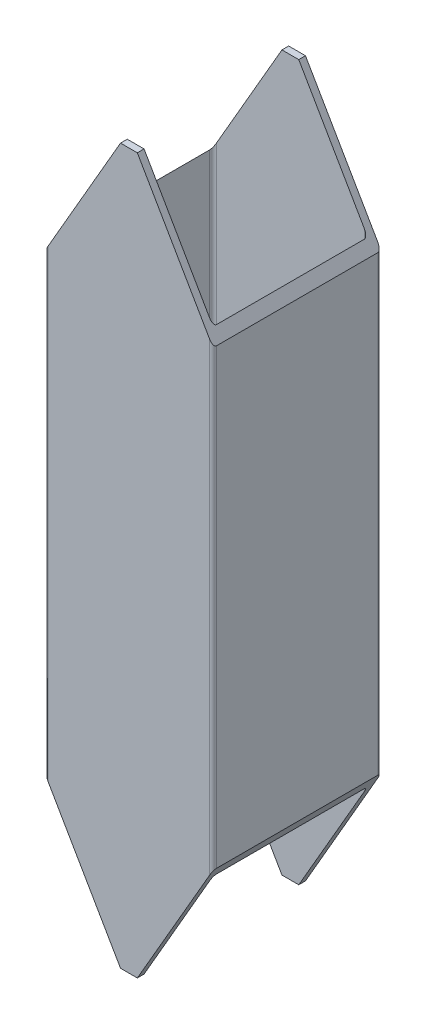
ISO-10303-21;
HEADER;
FILE_DESCRIPTION(('STEP AP214'),'2;1');
FILE_NAME('part.step','',(''),(''),'','','');
FILE_SCHEMA(('AUTOMOTIVE_DESIGN { 1 0 10303 214 1 1 1 1 }'));
ENDSEC;
DATA;
#1=APPLICATION_CONTEXT('core data for automotive mechanical design processes');
#2=APPLICATION_PROTOCOL_DEFINITION('international standard','automotive_design',2000,#1);
#3=PRODUCT_CONTEXT('',#1,'mechanical');
#4=PRODUCT('Part','Part','',(#3));
#5=PRODUCT_RELATED_PRODUCT_CATEGORY('part','',(#4));
#6=PRODUCT_DEFINITION_FORMATION('','',#4);
#7=PRODUCT_DEFINITION_CONTEXT('part definition',#1,'design');
#8=PRODUCT_DEFINITION('design','',#6,#7);
#9=PRODUCT_DEFINITION_SHAPE('','',#8);
#10=(LENGTH_UNIT() NAMED_UNIT(*) SI_UNIT(.MILLI.,.METRE.));
#11=(NAMED_UNIT(*) PLANE_ANGLE_UNIT() SI_UNIT($,.RADIAN.));
#12=(NAMED_UNIT(*) SI_UNIT($,.STERADIAN.) SOLID_ANGLE_UNIT());
#13=UNCERTAINTY_MEASURE_WITH_UNIT(LENGTH_MEASURE(1.E-05),#10,'distance_accuracy_value','');
#14=(GEOMETRIC_REPRESENTATION_CONTEXT(3) GLOBAL_UNCERTAINTY_ASSIGNED_CONTEXT((#13)) GLOBAL_UNIT_ASSIGNED_CONTEXT((#10,
#11,#12)) REPRESENTATION_CONTEXT('',''));
#15=CARTESIAN_POINT('',(0.,0.,0.));
#16=DIRECTION('',(0.,0.,1.));
#17=DIRECTION('',(1.,0.,0.));
#18=AXIS2_PLACEMENT_3D('',#15,#16,#17);
#19=CARTESIAN_POINT('',(2.,425.,-2.));
#20=DIRECTION('',(0.,1.,0.));
#21=DIRECTION('',(0.,0.,1.));
#22=AXIS2_PLACEMENT_3D('',#19,#20,#21);
#23=PLANE('',#22);
#24=DIRECTION('',(0.,0.,1.));
#25=VECTOR('',#24,1.);
#26=CARTESIAN_POINT('',(55.,425.,-100.));
#27=LINE('',#26,#25);
#28=CARTESIAN_POINT('',(55.,425.,-100.));
#29=VERTEX_POINT('',#28);
#30=CARTESIAN_POINT('',(55.,425.,-96.));
#31=VERTEX_POINT('',#30);
#32=EDGE_CURVE('E49',#29,#31,#27,.T.);
#33=ORIENTED_EDGE('',*,*,#32,.F.);
#34=DIRECTION('',(-1.,0.,0.));
#35=VECTOR('',#34,1.);
#36=CARTESIAN_POINT('',(2.00000000000001,425.,-100.));
#37=LINE('',#36,#35);
#38=CARTESIAN_POINT('',(45.,425.,-100.));
#39=VERTEX_POINT('',#38);
#40=EDGE_CURVE('E206',#29,#39,#37,.T.);
#41=ORIENTED_EDGE('',*,*,#40,.T.);
#42=DIRECTION('',(0.,0.,1.));
#43=VECTOR('',#42,1.);
#44=CARTESIAN_POINT('',(45.,425.,-100.));
#45=LINE('',#44,#43);
#46=CARTESIAN_POINT('',(45.,425.,-96.));
#47=VERTEX_POINT('',#46);
#48=EDGE_CURVE('E351',#39,#47,#45,.T.);
#49=ORIENTED_EDGE('',*,*,#48,.T.);
#50=DIRECTION('',(-1.,0.,0.));
#51=VECTOR('',#50,1.);
#52=CARTESIAN_POINT('',(6.00000000000001,425.,-96.));
#53=LINE('',#52,#51);
#54=EDGE_CURVE('E208',#31,#47,#53,.T.);
#55=ORIENTED_EDGE('',*,*,#54,.F.);
#56=EDGE_LOOP('',(#33,#41,#49,#55));
#57=FACE_BOUND('',#56,.T.);
#58=ADVANCED_FACE('F35',(#57),#23,.T.);
#59=CARTESIAN_POINT('',(2.,0.,-2.));
#60=DIRECTION('',(0.,1.,0.));
#61=DIRECTION('',(0.,0.,1.));
#62=AXIS2_PLACEMENT_3D('',#59,#60,#61);
#63=PLANE('',#62);
#64=DIRECTION('',(1.,0.,0.));
#65=VECTOR('',#64,1.);
#66=CARTESIAN_POINT('',(2.00000000000001,0.,0.));
#67=LINE('',#66,#65);
#68=CARTESIAN_POINT('',(45.,0.,0.));
#69=VERTEX_POINT('',#68);
#70=CARTESIAN_POINT('',(55.,0.,0.));
#71=VERTEX_POINT('',#70);
#72=EDGE_CURVE('E227',#69,#71,#67,.T.);
#73=ORIENTED_EDGE('',*,*,#72,.F.);
#74=DIRECTION('',(0.,0.,1.));
#75=VECTOR('',#74,1.);
#76=CARTESIAN_POINT('',(45.,0.,-100.));
#77=LINE('',#76,#75);
#78=CARTESIAN_POINT('',(45.,0.,-4.));
#79=VERTEX_POINT('',#78);
#80=EDGE_CURVE('E406',#79,#69,#77,.T.);
#81=ORIENTED_EDGE('',*,*,#80,.F.);
#82=DIRECTION('',(1.,0.,0.));
#83=VECTOR('',#82,1.);
#84=CARTESIAN_POINT('',(6.00000000000001,0.,-4.));
#85=LINE('',#84,#83);
#86=CARTESIAN_POINT('',(55.,0.,-4.));
#87=VERTEX_POINT('',#86);
#88=EDGE_CURVE('E367',#79,#87,#85,.T.);
#89=ORIENTED_EDGE('',*,*,#88,.T.);
#90=DIRECTION('',(0.,0.,1.));
#91=VECTOR('',#90,1.);
#92=CARTESIAN_POINT('',(55.,0.,-100.));
#93=LINE('',#92,#91);
#94=EDGE_CURVE('E327',#87,#71,#93,.T.);
#95=ORIENTED_EDGE('',*,*,#94,.T.);
#96=EDGE_LOOP('',(#73,#81,#89,#95));
#97=FACE_BOUND('',#96,.T.);
#98=ADVANCED_FACE('F418',(#97),#63,.F.);
#99=CARTESIAN_POINT('',(55.,425.,-4.));
#100=VERTEX_POINT('',#99);
#101=CARTESIAN_POINT('',(55.,425.,0.));
#102=VERTEX_POINT('',#101);
#103=EDGE_CURVE('E210',#100,#102,#27,.T.);
#104=ORIENTED_EDGE('',*,*,#103,.F.);
#105=DIRECTION('',(1.,0.,0.));
#106=VECTOR('',#105,1.);
#107=CARTESIAN_POINT('',(6.00000000000001,425.,-4.));
#108=LINE('',#107,#106);
#109=CARTESIAN_POINT('',(45.,425.,-4.));
#110=VERTEX_POINT('',#109);
#111=EDGE_CURVE('E276',#110,#100,#108,.T.);
#112=ORIENTED_EDGE('',*,*,#111,.F.);
#113=CARTESIAN_POINT('',(45.,425.,0.));
#114=VERTEX_POINT('',#113);
#115=EDGE_CURVE('E354',#110,#114,#45,.T.);
#116=ORIENTED_EDGE('',*,*,#115,.T.);
#117=DIRECTION('',(1.,0.,0.));
#118=VECTOR('',#117,1.);
#119=CARTESIAN_POINT('',(2.00000000000001,425.,0.));
#120=LINE('',#119,#118);
#121=EDGE_CURVE('E217',#114,#102,#120,.T.);
#122=ORIENTED_EDGE('',*,*,#121,.T.);
#123=EDGE_LOOP('',(#104,#112,#116,#122));
#124=FACE_BOUND('',#123,.T.);
#125=ADVANCED_FACE('F436',(#124),#23,.T.);
#126=DIRECTION('',(-1.,0.,0.));
#127=VECTOR('',#126,1.);
#128=CARTESIAN_POINT('',(6.00000000000001,0.,-96.));
#129=LINE('',#128,#127);
#130=CARTESIAN_POINT('',(55.,0.,-96.));
#131=VERTEX_POINT('',#130);
#132=CARTESIAN_POINT('',(45.,0.,-96.));
#133=VERTEX_POINT('',#132);
#134=EDGE_CURVE('E279',#131,#133,#129,.T.);
#135=ORIENTED_EDGE('',*,*,#134,.T.);
#136=CARTESIAN_POINT('',(45.,0.,-100.));
#137=VERTEX_POINT('',#136);
#138=EDGE_CURVE('E57',#137,#133,#77,.T.);
#139=ORIENTED_EDGE('',*,*,#138,.F.);
#140=DIRECTION('',(-1.,0.,0.));
#141=VECTOR('',#140,1.);
#142=CARTESIAN_POINT('',(2.00000000000001,0.,-100.));
#143=LINE('',#142,#141);
#144=CARTESIAN_POINT('',(55.,0.,-100.));
#145=VERTEX_POINT('',#144);
#146=EDGE_CURVE('E223',#145,#137,#143,.T.);
#147=ORIENTED_EDGE('',*,*,#146,.F.);
#148=EDGE_CURVE('E323',#145,#131,#93,.T.);
#149=ORIENTED_EDGE('',*,*,#148,.T.);
#150=EDGE_LOOP('',(#135,#139,#147,#149));
#151=FACE_BOUND('',#150,.T.);
#152=ADVANCED_FACE('F375',(#151),#63,.F.);
#153=CARTESIAN_POINT('',(2.,425.,-2.));
#154=DIRECTION('',(0.,-1.,0.));
#155=DIRECTION('',(0.,0.,-1.));
#156=AXIS2_PLACEMENT_3D('',#153,#154,#155);
#157=CYLINDRICAL_SURFACE('',#156,2.);
#158=DIRECTION('',(0.,-1.,0.));
#159=VECTOR('',#158,1.);
#160=CARTESIAN_POINT('',(0.,425.,-2.00000000000001));
#161=LINE('',#160,#159);
#162=CARTESIAN_POINT('',(0.,347.0577136594,-2.00000000000002));
#163=VERTEX_POINT('',#162);
#164=CARTESIAN_POINT('',(0.,77.9422863405987,-2.00000000000002));
#165=VERTEX_POINT('',#164);
#166=EDGE_CURVE('E216',#163,#165,#161,.T.);
#167=ORIENTED_EDGE('',*,*,#166,.T.);
#168=CARTESIAN_POINT('',(2.,74.478184725461,-2.));
#169=DIRECTION('',(0.866025403784436,0.500000000000004,0.));
#170=DIRECTION('',(0.500000000000004,-0.866025403784437,0.));
#171=AXIS2_PLACEMENT_3D('',#168,#169,#170);
#172=ELLIPSE('',#171,3.99999999999997,2.);
#173=CARTESIAN_POINT('',(2.00000000000005,74.4781847254609,0.));
#174=VERTEX_POINT('',#173);
#175=EDGE_CURVE('E313',#165,#174,#172,.T.);
#176=ORIENTED_EDGE('',*,*,#175,.T.);
#177=DIRECTION('',(0.,-1.,0.));
#178=VECTOR('',#177,1.);
#179=CARTESIAN_POINT('',(2.00000000000001,425.,0.));
#180=LINE('',#179,#178);
#181=CARTESIAN_POINT('',(2.00000000000002,350.521815274538,0.));
#182=VERTEX_POINT('',#181);
#183=EDGE_CURVE('E245',#182,#174,#180,.T.);
#184=ORIENTED_EDGE('',*,*,#183,.F.);
#185=CARTESIAN_POINT('',(2.,350.521815274538,-2.));
#186=DIRECTION('',(0.86602540378444,-0.499999999999998,0.));
#187=DIRECTION('',(-0.499999999999998,-0.86602540378444,0.));
#188=AXIS2_PLACEMENT_3D('',#185,#186,#187);
#189=ELLIPSE('',#188,4.00000000000002,2.);
#190=EDGE_CURVE('E364',#182,#163,#189,.T.);
#191=ORIENTED_EDGE('',*,*,#190,.T.);
#192=EDGE_LOOP('',(#167,#176,#184,#191));
#193=FACE_BOUND('',#192,.T.);
#194=ADVANCED_FACE('F37',(#193),#157,.T.);
#195=CARTESIAN_POINT('',(2.00000000000001,425.,0.));
#196=DIRECTION('',(0.,0.,-1.));
#197=DIRECTION('',(-1.,0.,0.));
#198=AXIS2_PLACEMENT_3D('',#195,#196,#197);
#199=PLANE('',#198);
#200=DIRECTION('',(0.,-1.,0.));
#201=VECTOR('',#200,1.);
#202=CARTESIAN_POINT('',(98.,425.,0.));
#203=LINE('',#202,#201);
#204=CARTESIAN_POINT('',(98.,350.521815274538,0.));
#205=VERTEX_POINT('',#204);
#206=CARTESIAN_POINT('',(98.,74.478184725461,0.));
#207=VERTEX_POINT('',#206);
#208=EDGE_CURVE('E243',#205,#207,#203,.T.);
#209=ORIENTED_EDGE('',*,*,#208,.F.);
#210=DIRECTION('',(0.499999999999998,-0.86602540378444,0.));
#211=VECTOR('',#210,1.);
#212=CARTESIAN_POINT('',(55.,425.,0.));
#213=LINE('',#212,#211);
#214=EDGE_CURVE('E201',#102,#205,#213,.T.);
#215=ORIENTED_EDGE('',*,*,#214,.F.);
#216=ORIENTED_EDGE('',*,*,#121,.F.);
#217=DIRECTION('',(0.499999999999998,0.86602540378444,0.));
#218=VECTOR('',#217,1.);
#219=CARTESIAN_POINT('',(45.,425.,0.));
#220=LINE('',#219,#218);
#221=EDGE_CURVE('E347',#182,#114,#220,.T.);
#222=ORIENTED_EDGE('',*,*,#221,.F.);
#223=ORIENTED_EDGE('',*,*,#183,.T.);
#224=DIRECTION('',(-0.500000000000004,0.866025403784436,0.));
#225=VECTOR('',#224,1.);
#226=CARTESIAN_POINT('',(45.,0.,0.));
#227=LINE('',#226,#225);
#228=EDGE_CURVE('E402',#69,#174,#227,.T.);
#229=ORIENTED_EDGE('',*,*,#228,.F.);
#230=ORIENTED_EDGE('',*,*,#72,.T.);
#231=DIRECTION('',(-0.500000000000003,-0.866025403784437,0.));
#232=VECTOR('',#231,1.);
#233=CARTESIAN_POINT('',(55.,0.,0.));
#234=LINE('',#233,#232);
#235=EDGE_CURVE('E316',#207,#71,#234,.T.);
#236=ORIENTED_EDGE('',*,*,#235,.F.);
#237=EDGE_LOOP('',(#209,#215,#216,#222,#223,#229,#230,#236));
#238=FACE_BOUND('',#237,.T.);
#239=ADVANCED_FACE('F414',(#238),#199,.F.);
#240=CARTESIAN_POINT('',(98.,425.,-2.));
#241=DIRECTION('',(0.,-1.,0.));
#242=DIRECTION('',(0.,0.,-1.));
#243=AXIS2_PLACEMENT_3D('',#240,#241,#242);
#244=CYLINDRICAL_SURFACE('',#243,2.);
#245=DIRECTION('',(0.,-1.,0.));
#246=VECTOR('',#245,1.);
#247=CARTESIAN_POINT('',(100.,425.,-2.00000000000001));
#248=LINE('',#247,#246);
#249=CARTESIAN_POINT('',(100.,347.0577136594,-2.00000000000002));
#250=VERTEX_POINT('',#249);
#251=CARTESIAN_POINT('',(100.,77.9422863405988,-2.00000000000002));
#252=VERTEX_POINT('',#251);
#253=EDGE_CURVE('E241',#250,#252,#248,.T.);
#254=ORIENTED_EDGE('',*,*,#253,.F.);
#255=CARTESIAN_POINT('',(98.,350.521815274538,-2.));
#256=DIRECTION('',(-0.86602540378444,-0.499999999999998,0.));
#257=DIRECTION('',(0.499999999999998,-0.86602540378444,0.));
#258=AXIS2_PLACEMENT_3D('',#255,#256,#257);
#259=ELLIPSE('',#258,4.00000000000002,2.);
#260=EDGE_CURVE('E399',#250,#205,#259,.T.);
#261=ORIENTED_EDGE('',*,*,#260,.T.);
#262=ORIENTED_EDGE('',*,*,#208,.T.);
#263=CARTESIAN_POINT('',(98.,74.478184725461,-2.));
#264=DIRECTION('',(-0.866025403784437,0.500000000000003,0.));
#265=DIRECTION('',(-0.500000000000003,-0.866025403784437,0.));
#266=AXIS2_PLACEMENT_3D('',#263,#264,#265);
#267=ELLIPSE('',#266,3.99999999999997,2.);
#268=EDGE_CURVE('E344',#207,#252,#267,.T.);
#269=ORIENTED_EDGE('',*,*,#268,.T.);
#270=EDGE_LOOP('',(#254,#261,#262,#269));
#271=FACE_BOUND('',#270,.T.);
#272=ADVANCED_FACE('F446',(#271),#244,.T.);
#273=CARTESIAN_POINT('',(100.,425.,-2.00000000000001));
#274=DIRECTION('',(-1.,0.,0.));
#275=DIRECTION('',(0.,0.,1.));
#276=AXIS2_PLACEMENT_3D('',#273,#274,#275);
#277=PLANE('',#276);
#278=DIRECTION('',(0.,-1.,0.));
#279=VECTOR('',#278,1.);
#280=CARTESIAN_POINT('',(100.,425.,-98.));
#281=LINE('',#280,#279);
#282=CARTESIAN_POINT('',(100.,347.0577136594,-98.));
#283=VERTEX_POINT('',#282);
#284=CARTESIAN_POINT('',(100.,77.9422863405988,-98.));
#285=VERTEX_POINT('',#284);
#286=EDGE_CURVE('E239',#283,#285,#281,.T.);
#287=ORIENTED_EDGE('',*,*,#286,.F.);
#288=DIRECTION('',(0.,0.,1.));
#289=VECTOR('',#288,1.);
#290=CARTESIAN_POINT('',(100.,347.0577136594,-100.));
#291=LINE('',#290,#289);
#292=EDGE_CURVE('E200',#283,#250,#291,.T.);
#293=ORIENTED_EDGE('',*,*,#292,.T.);
#294=ORIENTED_EDGE('',*,*,#253,.T.);
#295=DIRECTION('',(0.,0.,1.));
#296=VECTOR('',#295,1.);
#297=CARTESIAN_POINT('',(100.,77.9422863405988,-100.));
#298=LINE('',#297,#296);
#299=EDGE_CURVE('E320',#285,#252,#298,.T.);
#300=ORIENTED_EDGE('',*,*,#299,.F.);
#301=EDGE_LOOP('',(#287,#293,#294,#300));
#302=FACE_BOUND('',#301,.T.);
#303=ADVANCED_FACE('F450',(#302),#277,.F.);
#304=CARTESIAN_POINT('',(98.,425.,-98.));
#305=DIRECTION('',(0.,-1.,0.));
#306=DIRECTION('',(0.,0.,-1.));
#307=AXIS2_PLACEMENT_3D('',#304,#305,#306);
#308=CYLINDRICAL_SURFACE('',#307,2.);
#309=DIRECTION('',(0.,-1.,0.));
#310=VECTOR('',#309,1.);
#311=CARTESIAN_POINT('',(98.,425.,-100.));
#312=LINE('',#311,#310);
#313=CARTESIAN_POINT('',(98.,350.521815274538,-100.));
#314=VERTEX_POINT('',#313);
#315=CARTESIAN_POINT('',(98.,74.478184725461,-100.));
#316=VERTEX_POINT('',#315);
#317=EDGE_CURVE('E237',#314,#316,#312,.T.);
#318=ORIENTED_EDGE('',*,*,#317,.F.);
#319=CARTESIAN_POINT('',(98.,350.521815274538,-98.));
#320=DIRECTION('',(-0.86602540378444,-0.499999999999998,0.));
#321=DIRECTION('',(0.499999999999998,-0.86602540378444,0.));
#322=AXIS2_PLACEMENT_3D('',#319,#320,#321);
#323=ELLIPSE('',#322,4.00000000000002,2.);
#324=EDGE_CURVE('E196',#314,#283,#323,.T.);
#325=ORIENTED_EDGE('',*,*,#324,.T.);
#326=ORIENTED_EDGE('',*,*,#286,.T.);
#327=CARTESIAN_POINT('',(98.,74.478184725461,-98.));
#328=DIRECTION('',(-0.866025403784437,0.500000000000003,0.));
#329=DIRECTION('',(-0.500000000000003,-0.866025403784437,0.));
#330=AXIS2_PLACEMENT_3D('',#327,#328,#329);
#331=ELLIPSE('',#330,3.99999999999998,2.);
#332=EDGE_CURVE('E341',#285,#316,#331,.T.);
#333=ORIENTED_EDGE('',*,*,#332,.T.);
#334=EDGE_LOOP('',(#318,#325,#326,#333));
#335=FACE_BOUND('',#334,.T.);
#336=ADVANCED_FACE('F453',(#335),#308,.T.);
#337=CARTESIAN_POINT('',(2.00000000000001,425.,-100.));
#338=DIRECTION('',(0.,0.,1.));
#339=DIRECTION('',(1.,0.,0.));
#340=AXIS2_PLACEMENT_3D('',#337,#338,#339);
#341=PLANE('',#340);
#342=ORIENTED_EDGE('',*,*,#40,.F.);
#343=DIRECTION('',(0.499999999999998,-0.86602540378444,0.));
#344=VECTOR('',#343,1.);
#345=CARTESIAN_POINT('',(55.,425.,-100.));
#346=LINE('',#345,#344);
#347=EDGE_CURVE('E193',#29,#314,#346,.T.);
#348=ORIENTED_EDGE('',*,*,#347,.T.);
#349=ORIENTED_EDGE('',*,*,#317,.T.);
#350=DIRECTION('',(-0.500000000000003,-0.866025403784437,0.));
#351=VECTOR('',#350,1.);
#352=CARTESIAN_POINT('',(55.,0.,-100.));
#353=LINE('',#352,#351);
#354=EDGE_CURVE('E317',#316,#145,#353,.T.);
#355=ORIENTED_EDGE('',*,*,#354,.T.);
#356=ORIENTED_EDGE('',*,*,#146,.T.);
#357=DIRECTION('',(-0.500000000000004,0.866025403784436,0.));
#358=VECTOR('',#357,1.);
#359=CARTESIAN_POINT('',(45.,0.,-100.));
#360=LINE('',#359,#358);
#361=CARTESIAN_POINT('',(1.99999999999998,74.478184725461,-100.));
#362=VERTEX_POINT('',#361);
#363=EDGE_CURVE('E403',#137,#362,#360,.T.);
#364=ORIENTED_EDGE('',*,*,#363,.T.);
#365=DIRECTION('',(0.,-1.,0.));
#366=VECTOR('',#365,1.);
#367=CARTESIAN_POINT('',(2.00000000000001,425.,-100.));
#368=LINE('',#367,#366);
#369=CARTESIAN_POINT('',(2.,350.521815274538,-100.));
#370=VERTEX_POINT('',#369);
#371=EDGE_CURVE('E234',#370,#362,#368,.T.);
#372=ORIENTED_EDGE('',*,*,#371,.F.);
#373=DIRECTION('',(0.499999999999998,0.86602540378444,0.));
#374=VECTOR('',#373,1.);
#375=CARTESIAN_POINT('',(45.,425.,-100.));
#376=LINE('',#375,#374);
#377=EDGE_CURVE('E215',#370,#39,#376,.T.);
#378=ORIENTED_EDGE('',*,*,#377,.T.);
#379=EDGE_LOOP('',(#342,#348,#349,#355,#356,#364,#372,#378));
#380=FACE_BOUND('',#379,.T.);
#381=ADVANCED_FACE('F213',(#380),#341,.F.);
#382=CARTESIAN_POINT('',(2.,425.,-98.));
#383=DIRECTION('',(0.,-1.,0.));
#384=DIRECTION('',(0.,0.,-1.));
#385=AXIS2_PLACEMENT_3D('',#382,#383,#384);
#386=CYLINDRICAL_SURFACE('',#385,2.);
#387=ORIENTED_EDGE('',*,*,#371,.T.);
#388=CARTESIAN_POINT('',(2.,74.478184725461,-98.));
#389=DIRECTION('',(0.866025403784436,0.500000000000004,0.));
#390=DIRECTION('',(0.500000000000004,-0.866025403784437,0.));
#391=AXIS2_PLACEMENT_3D('',#388,#389,#390);
#392=ELLIPSE('',#391,3.99999999999997,2.);
#393=CARTESIAN_POINT('',(0.,77.9422863405987,-98.));
#394=VERTEX_POINT('',#393);
#395=EDGE_CURVE('E307',#362,#394,#392,.T.);
#396=ORIENTED_EDGE('',*,*,#395,.T.);
#397=DIRECTION('',(0.,-1.,0.));
#398=VECTOR('',#397,1.);
#399=CARTESIAN_POINT('',(0.,425.,-98.));
#400=LINE('',#399,#398);
#401=CARTESIAN_POINT('',(0.,347.0577136594,-98.));
#402=VERTEX_POINT('',#401);
#403=EDGE_CURVE('E220',#402,#394,#400,.T.);
#404=ORIENTED_EDGE('',*,*,#403,.F.);
#405=CARTESIAN_POINT('',(2.,350.521815274538,-98.));
#406=DIRECTION('',(0.86602540378444,-0.499999999999998,0.));
#407=DIRECTION('',(-0.499999999999998,-0.86602540378444,0.));
#408=AXIS2_PLACEMENT_3D('',#405,#406,#407);
#409=ELLIPSE('',#408,4.00000000000002,2.);
#410=EDGE_CURVE('E361',#402,#370,#409,.T.);
#411=ORIENTED_EDGE('',*,*,#410,.T.);
#412=EDGE_LOOP('',(#387,#396,#404,#411));
#413=FACE_BOUND('',#412,.T.);
#414=ADVANCED_FACE('F455',(#413),#386,.T.);
#415=CARTESIAN_POINT('',(0.,425.,-2.00000000000001));
#416=DIRECTION('',(1.,0.,0.));
#417=DIRECTION('',(0.,0.,-1.));
#418=AXIS2_PLACEMENT_3D('',#415,#416,#417);
#419=PLANE('',#418);
#420=ORIENTED_EDGE('',*,*,#403,.T.);
#421=DIRECTION('',(0.,0.,1.));
#422=VECTOR('',#421,1.);
#423=CARTESIAN_POINT('',(0.,77.9422863405987,-100.));
#424=LINE('',#423,#422);
#425=EDGE_CURVE('E268',#394,#165,#424,.T.);
#426=ORIENTED_EDGE('',*,*,#425,.T.);
#427=ORIENTED_EDGE('',*,*,#166,.F.);
#428=DIRECTION('',(0.,0.,1.));
#429=VECTOR('',#428,1.);
#430=CARTESIAN_POINT('',(0.,347.0577136594,-100.));
#431=LINE('',#430,#429);
#432=EDGE_CURVE('E349',#402,#163,#431,.T.);
#433=ORIENTED_EDGE('',*,*,#432,.F.);
#434=EDGE_LOOP('',(#420,#426,#427,#433));
#435=FACE_BOUND('',#434,.T.);
#436=ADVANCED_FACE('F460',(#435),#419,.F.);
#437=CARTESIAN_POINT('',(6.,425.,-94.));
#438=DIRECTION('',(0.,-1.,0.));
#439=DIRECTION('',(0.,0.,-1.));
#440=AXIS2_PLACEMENT_3D('',#437,#438,#439);
#441=CYLINDRICAL_SURFACE('',#440,2.);
#442=CARTESIAN_POINT('',(6.,67.5499814951855,-94.));
#443=DIRECTION('',(0.866025403784436,0.500000000000004,0.));
#444=DIRECTION('',(0.500000000000004,-0.866025403784437,0.));
#445=AXIS2_PLACEMENT_3D('',#442,#443,#444);
#446=ELLIPSE('',#445,3.99999999999997,2.);
#447=CARTESIAN_POINT('',(6.00000000000001,67.5499814951854,-96.));
#448=VERTEX_POINT('',#447);
#449=CARTESIAN_POINT('',(4.,71.0140831103233,-94.));
#450=VERTEX_POINT('',#449);
#451=EDGE_CURVE('E254',#448,#450,#446,.T.);
#452=ORIENTED_EDGE('',*,*,#451,.F.);
#453=DIRECTION('',(0.,-1.,0.));
#454=VECTOR('',#453,1.);
#455=CARTESIAN_POINT('',(6.00000000000001,425.,-96.));
#456=LINE('',#455,#454);
#457=CARTESIAN_POINT('',(6.00000000000001,357.450018504813,-96.));
#458=VERTEX_POINT('',#457);
#459=EDGE_CURVE('E265',#458,#448,#456,.T.);
#460=ORIENTED_EDGE('',*,*,#459,.F.);
#461=CARTESIAN_POINT('',(6.,357.450018504813,-94.));
#462=DIRECTION('',(0.86602540378444,-0.499999999999998,0.));
#463=DIRECTION('',(-0.499999999999998,-0.86602540378444,0.));
#464=AXIS2_PLACEMENT_3D('',#461,#462,#463);
#465=ELLIPSE('',#464,4.00000000000002,2.);
#466=CARTESIAN_POINT('',(4.,353.985916889676,-94.));
#467=VERTEX_POINT('',#466);
#468=EDGE_CURVE('E353',#467,#458,#465,.T.);
#469=ORIENTED_EDGE('',*,*,#468,.F.);
#470=DIRECTION('',(0.,-1.,0.));
#471=VECTOR('',#470,1.);
#472=CARTESIAN_POINT('',(4.,425.,-94.));
#473=LINE('',#472,#471);
#474=EDGE_CURVE('E229',#467,#450,#473,.T.);
#475=ORIENTED_EDGE('',*,*,#474,.T.);
#476=EDGE_LOOP('',(#452,#460,#469,#475));
#477=FACE_BOUND('',#476,.T.);
#478=ADVANCED_FACE('F263',(#477),#441,.F.);
#479=CARTESIAN_POINT('',(4.,425.,-6.00000000000001));
#480=DIRECTION('',(1.,0.,0.));
#481=DIRECTION('',(0.,0.,-1.));
#482=AXIS2_PLACEMENT_3D('',#479,#480,#481);
#483=PLANE('',#482);
#484=DIRECTION('',(0.,0.,1.));
#485=VECTOR('',#484,1.);
#486=CARTESIAN_POINT('',(4.,71.0140831103233,-6.00000000000001));
#487=LINE('',#486,#485);
#488=CARTESIAN_POINT('',(4.,71.0140831103233,-6.00000000000001));
#489=VERTEX_POINT('',#488);
#490=EDGE_CURVE('E267',#450,#489,#487,.T.);
#491=ORIENTED_EDGE('',*,*,#490,.F.);
#492=ORIENTED_EDGE('',*,*,#474,.F.);
#493=DIRECTION('',(0.,0.,-1.));
#494=VECTOR('',#493,1.);
#495=CARTESIAN_POINT('',(4.,353.985916889676,-6.00000000000001));
#496=LINE('',#495,#494);
#497=CARTESIAN_POINT('',(4.,353.985916889676,-6.00000000000001));
#498=VERTEX_POINT('',#497);
#499=EDGE_CURVE('E296',#498,#467,#496,.T.);
#500=ORIENTED_EDGE('',*,*,#499,.F.);
#501=DIRECTION('',(0.,-1.,0.));
#502=VECTOR('',#501,1.);
#503=CARTESIAN_POINT('',(4.,425.,-6.00000000000001));
#504=LINE('',#503,#502);
#505=EDGE_CURVE('E290',#498,#489,#504,.T.);
#506=ORIENTED_EDGE('',*,*,#505,.T.);
#507=EDGE_LOOP('',(#491,#492,#500,#506));
#508=FACE_BOUND('',#507,.T.);
#509=ADVANCED_FACE('F295',(#508),#483,.T.);
#510=CARTESIAN_POINT('',(6.,425.,-6.));
#511=DIRECTION('',(0.,-1.,0.));
#512=DIRECTION('',(0.,0.,-1.));
#513=AXIS2_PLACEMENT_3D('',#510,#511,#512);
#514=CYLINDRICAL_SURFACE('',#513,2.);
#515=CARTESIAN_POINT('',(6.,67.5499814951855,-6.));
#516=DIRECTION('',(0.866025403784436,0.500000000000004,0.));
#517=DIRECTION('',(0.500000000000004,-0.866025403784437,0.));
#518=AXIS2_PLACEMENT_3D('',#515,#516,#517);
#519=ELLIPSE('',#518,3.99999999999997,2.);
#520=CARTESIAN_POINT('',(6.00000000000001,67.5499814951855,-4.));
#521=VERTEX_POINT('',#520);
#522=EDGE_CURVE('E303',#489,#521,#519,.T.);
#523=ORIENTED_EDGE('',*,*,#522,.F.);
#524=ORIENTED_EDGE('',*,*,#505,.F.);
#525=CARTESIAN_POINT('',(6.,357.450018504813,-6.));
#526=DIRECTION('',(0.86602540378444,-0.499999999999998,0.));
#527=DIRECTION('',(-0.499999999999998,-0.86602540378444,0.));
#528=AXIS2_PLACEMENT_3D('',#525,#526,#527);
#529=ELLIPSE('',#528,4.00000000000002,2.);
#530=CARTESIAN_POINT('',(6.00000000000001,357.450018504813,-4.));
#531=VERTEX_POINT('',#530);
#532=EDGE_CURVE('E301',#531,#498,#529,.T.);
#533=ORIENTED_EDGE('',*,*,#532,.F.);
#534=DIRECTION('',(0.,-1.,0.));
#535=VECTOR('',#534,1.);
#536=CARTESIAN_POINT('',(6.00000000000001,425.,-4.));
#537=LINE('',#536,#535);
#538=EDGE_CURVE('E287',#531,#521,#537,.T.);
#539=ORIENTED_EDGE('',*,*,#538,.T.);
#540=EDGE_LOOP('',(#523,#524,#533,#539));
#541=FACE_BOUND('',#540,.T.);
#542=ADVANCED_FACE('F300',(#541),#514,.F.);
#543=CARTESIAN_POINT('',(6.00000000000001,425.,-4.));
#544=DIRECTION('',(0.,0.,-1.));
#545=DIRECTION('',(-1.,0.,0.));
#546=AXIS2_PLACEMENT_3D('',#543,#544,#545);
#547=PLANE('',#546);
#548=DIRECTION('',(-0.499999999999998,0.86602540378444,0.));
#549=VECTOR('',#548,1.);
#550=CARTESIAN_POINT('',(42.7500000000001,446.217622392719,-4.));
#551=LINE('',#550,#549);
#552=CARTESIAN_POINT('',(94.,357.450018504813,-4.));
#553=VERTEX_POINT('',#552);
#554=EDGE_CURVE('E396',#553,#100,#551,.T.);
#555=ORIENTED_EDGE('',*,*,#554,.F.);
#556=DIRECTION('',(0.,-1.,0.));
#557=VECTOR('',#556,1.);
#558=CARTESIAN_POINT('',(94.,425.,-4.));
#559=LINE('',#558,#557);
#560=CARTESIAN_POINT('',(94.,67.5499814951856,-4.));
#561=VERTEX_POINT('',#560);
#562=EDGE_CURVE('E285',#553,#561,#559,.T.);
#563=ORIENTED_EDGE('',*,*,#562,.T.);
#564=DIRECTION('',(0.500000000000003,0.866025403784437,0.));
#565=VECTOR('',#564,1.);
#566=CARTESIAN_POINT('',(226.780398304194,297.53237760728,-4.));
#567=LINE('',#566,#565);
#568=EDGE_CURVE('E338',#87,#561,#567,.T.);
#569=ORIENTED_EDGE('',*,*,#568,.F.);
#570=ORIENTED_EDGE('',*,*,#88,.F.);
#571=DIRECTION('',(0.500000000000004,-0.866025403784437,0.));
#572=VECTOR('',#571,1.);
#573=CARTESIAN_POINT('',(-148.780398304194,335.637495373795,-4.));
#574=LINE('',#573,#572);
#575=EDGE_CURVE('E305',#521,#79,#574,.T.);
#576=ORIENTED_EDGE('',*,*,#575,.F.);
#577=ORIENTED_EDGE('',*,*,#538,.F.);
#578=DIRECTION('',(-0.499999999999998,-0.86602540378444,0.));
#579=VECTOR('',#578,1.);
#580=CARTESIAN_POINT('',(35.2500000000001,408.112504626203,-4.));
#581=LINE('',#580,#579);
#582=EDGE_CURVE('E359',#110,#531,#581,.T.);
#583=ORIENTED_EDGE('',*,*,#582,.F.);
#584=ORIENTED_EDGE('',*,*,#111,.T.);
#585=EDGE_LOOP('',(#555,#563,#569,#570,#576,#577,#583,#584));
#586=FACE_BOUND('',#585,.T.);
#587=ADVANCED_FACE('F424',(#586),#547,.T.);
#588=CARTESIAN_POINT('',(94.,425.,-6.));
#589=DIRECTION('',(0.,-1.,0.));
#590=DIRECTION('',(0.,0.,-1.));
#591=AXIS2_PLACEMENT_3D('',#588,#589,#590);
#592=CYLINDRICAL_SURFACE('',#591,2.);
#593=CARTESIAN_POINT('',(94.,357.450018504813,-6.));
#594=DIRECTION('',(-0.86602540378444,-0.499999999999998,0.));
#595=DIRECTION('',(0.499999999999998,-0.86602540378444,0.));
#596=AXIS2_PLACEMENT_3D('',#593,#594,#595);
#597=ELLIPSE('',#596,4.00000000000002,2.);
#598=CARTESIAN_POINT('',(96.,353.985916889676,-6.00000000000001));
#599=VERTEX_POINT('',#598);
#600=EDGE_CURVE('E391',#599,#553,#597,.T.);
#601=ORIENTED_EDGE('',*,*,#600,.F.);
#602=DIRECTION('',(0.,-1.,0.));
#603=VECTOR('',#602,1.);
#604=CARTESIAN_POINT('',(96.,425.,-6.00000000000001));
#605=LINE('',#604,#603);
#606=CARTESIAN_POINT('',(96.,71.0140831103233,-6.00000000000001));
#607=VERTEX_POINT('',#606);
#608=EDGE_CURVE('E283',#599,#607,#605,.T.);
#609=ORIENTED_EDGE('',*,*,#608,.T.);
#610=CARTESIAN_POINT('',(94.,67.5499814951856,-6.));
#611=DIRECTION('',(-0.866025403784437,0.500000000000003,0.));
#612=DIRECTION('',(-0.500000000000003,-0.866025403784437,0.));
#613=AXIS2_PLACEMENT_3D('',#610,#611,#612);
#614=ELLIPSE('',#613,3.99999999999997,2.);
#615=EDGE_CURVE('E335',#561,#607,#614,.T.);
#616=ORIENTED_EDGE('',*,*,#615,.F.);
#617=ORIENTED_EDGE('',*,*,#562,.F.);
#618=EDGE_LOOP('',(#601,#609,#616,#617));
#619=FACE_BOUND('',#618,.T.);
#620=ADVANCED_FACE('F428',(#619),#592,.F.);
#621=CARTESIAN_POINT('',(96.,425.,-6.00000000000001));
#622=DIRECTION('',(-1.,0.,0.));
#623=DIRECTION('',(0.,0.,1.));
#624=AXIS2_PLACEMENT_3D('',#621,#622,#623);
#625=PLANE('',#624);
#626=DIRECTION('',(0.,0.,1.));
#627=VECTOR('',#626,1.);
#628=CARTESIAN_POINT('',(96.,353.985916889676,-6.00000000000001));
#629=LINE('',#628,#627);
#630=CARTESIAN_POINT('',(96.,353.985916889676,-94.));
#631=VERTEX_POINT('',#630);
#632=EDGE_CURVE('E389',#631,#599,#629,.T.);
#633=ORIENTED_EDGE('',*,*,#632,.F.);
#634=DIRECTION('',(0.,-1.,0.));
#635=VECTOR('',#634,1.);
#636=CARTESIAN_POINT('',(96.,425.,-94.));
#637=LINE('',#636,#635);
#638=CARTESIAN_POINT('',(96.,71.0140831103234,-94.));
#639=VERTEX_POINT('',#638);
#640=EDGE_CURVE('E274',#631,#639,#637,.T.);
#641=ORIENTED_EDGE('',*,*,#640,.T.);
#642=DIRECTION('',(0.,0.,-1.));
#643=VECTOR('',#642,1.);
#644=CARTESIAN_POINT('',(96.,71.0140831103233,-6.00000000000001));
#645=LINE('',#644,#643);
#646=EDGE_CURVE('E332',#607,#639,#645,.T.);
#647=ORIENTED_EDGE('',*,*,#646,.F.);
#648=ORIENTED_EDGE('',*,*,#608,.F.);
#649=EDGE_LOOP('',(#633,#641,#647,#648));
#650=FACE_BOUND('',#649,.T.);
#651=ADVANCED_FACE('F431',(#650),#625,.T.);
#652=CARTESIAN_POINT('',(94.,425.,-94.));
#653=DIRECTION('',(0.,-1.,0.));
#654=DIRECTION('',(0.,0.,-1.));
#655=AXIS2_PLACEMENT_3D('',#652,#653,#654);
#656=CYLINDRICAL_SURFACE('',#655,2.);
#657=CARTESIAN_POINT('',(94.,357.450018504813,-94.));
#658=DIRECTION('',(-0.86602540378444,-0.499999999999998,0.));
#659=DIRECTION('',(0.499999999999998,-0.86602540378444,0.));
#660=AXIS2_PLACEMENT_3D('',#657,#658,#659);
#661=ELLIPSE('',#660,4.00000000000002,2.);
#662=CARTESIAN_POINT('',(94.,357.450018504813,-96.));
#663=VERTEX_POINT('',#662);
#664=EDGE_CURVE('E209',#663,#631,#661,.T.);
#665=ORIENTED_EDGE('',*,*,#664,.F.);
#666=DIRECTION('',(0.,-1.,0.));
#667=VECTOR('',#666,1.);
#668=CARTESIAN_POINT('',(94.,425.,-96.));
#669=LINE('',#668,#667);
#670=CARTESIAN_POINT('',(94.,67.5499814951855,-96.));
#671=VERTEX_POINT('',#670);
#672=EDGE_CURVE('E272',#663,#671,#669,.T.);
#673=ORIENTED_EDGE('',*,*,#672,.T.);
#674=CARTESIAN_POINT('',(94.,67.5499814951856,-94.));
#675=DIRECTION('',(-0.866025403784437,0.500000000000003,0.));
#676=DIRECTION('',(-0.500000000000003,-0.866025403784437,0.));
#677=AXIS2_PLACEMENT_3D('',#674,#675,#676);
#678=ELLIPSE('',#677,3.99999999999998,2.);
#679=EDGE_CURVE('E326',#639,#671,#678,.T.);
#680=ORIENTED_EDGE('',*,*,#679,.F.);
#681=ORIENTED_EDGE('',*,*,#640,.F.);
#682=EDGE_LOOP('',(#665,#673,#680,#681));
#683=FACE_BOUND('',#682,.T.);
#684=ADVANCED_FACE('F387',(#683),#656,.F.);
#685=CARTESIAN_POINT('',(6.00000000000001,425.,-96.));
#686=DIRECTION('',(0.,0.,1.));
#687=DIRECTION('',(1.,0.,0.));
#688=AXIS2_PLACEMENT_3D('',#685,#686,#687);
#689=PLANE('',#688);
#690=DIRECTION('',(0.499999999999998,-0.86602540378444,0.));
#691=VECTOR('',#690,1.);
#692=CARTESIAN_POINT('',(42.7500000000001,446.217622392719,-96.));
#693=LINE('',#692,#691);
#694=EDGE_CURVE('E11',#31,#663,#693,.T.);
#695=ORIENTED_EDGE('',*,*,#694,.F.);
#696=ORIENTED_EDGE('',*,*,#54,.T.);
#697=DIRECTION('',(0.499999999999998,0.86602540378444,0.));
#698=VECTOR('',#697,1.);
#699=CARTESIAN_POINT('',(35.2500000000001,408.112504626203,-96.));
#700=LINE('',#699,#698);
#701=EDGE_CURVE('E248',#458,#47,#700,.T.);
#702=ORIENTED_EDGE('',*,*,#701,.F.);
#703=ORIENTED_EDGE('',*,*,#459,.T.);
#704=DIRECTION('',(-0.500000000000004,0.866025403784437,0.));
#705=VECTOR('',#704,1.);
#706=CARTESIAN_POINT('',(-148.780398304194,335.637495373795,-96.));
#707=LINE('',#706,#705);
#708=EDGE_CURVE('E43',#133,#448,#707,.T.);
#709=ORIENTED_EDGE('',*,*,#708,.F.);
#710=ORIENTED_EDGE('',*,*,#134,.F.);
#711=DIRECTION('',(-0.500000000000003,-0.866025403784437,0.));
#712=VECTOR('',#711,1.);
#713=CARTESIAN_POINT('',(226.780398304194,297.53237760728,-96.));
#714=LINE('',#713,#712);
#715=EDGE_CURVE('E251',#671,#131,#714,.T.);
#716=ORIENTED_EDGE('',*,*,#715,.F.);
#717=ORIENTED_EDGE('',*,*,#672,.F.);
#718=EDGE_LOOP('',(#695,#696,#702,#703,#709,#710,#716,#717));
#719=FACE_BOUND('',#718,.T.);
#720=ADVANCED_FACE('F271',(#719),#689,.T.);
#721=CARTESIAN_POINT('',(45.,425.,-100.));
#722=DIRECTION('',(0.86602540378444,-0.499999999999998,0.));
#723=DIRECTION('',(0.499999999999998,0.86602540378444,0.));
#724=AXIS2_PLACEMENT_3D('',#721,#722,#723);
#725=PLANE('',#724);
#726=ORIENTED_EDGE('',*,*,#221,.T.);
#727=ORIENTED_EDGE('',*,*,#115,.F.);
#728=ORIENTED_EDGE('',*,*,#582,.T.);
#729=ORIENTED_EDGE('',*,*,#532,.T.);
#730=ORIENTED_EDGE('',*,*,#499,.T.);
#731=ORIENTED_EDGE('',*,*,#468,.T.);
#732=ORIENTED_EDGE('',*,*,#701,.T.);
#733=ORIENTED_EDGE('',*,*,#48,.F.);
#734=ORIENTED_EDGE('',*,*,#377,.F.);
#735=ORIENTED_EDGE('',*,*,#410,.F.);
#736=ORIENTED_EDGE('',*,*,#432,.T.);
#737=ORIENTED_EDGE('',*,*,#190,.F.);
#738=EDGE_LOOP('',(#726,#727,#728,#729,#730,#731,#732,#733,#734,#735,#736,#737));
#739=FACE_BOUND('',#738,.T.);
#740=ADVANCED_FACE('F441',(#739),#725,.F.);
#741=CARTESIAN_POINT('',(55.,0.,-100.));
#742=DIRECTION('',(-0.866025403784437,0.500000000000003,0.));
#743=DIRECTION('',(-0.500000000000003,-0.866025403784437,0.));
#744=AXIS2_PLACEMENT_3D('',#741,#742,#743);
#745=PLANE('',#744);
#746=ORIENTED_EDGE('',*,*,#235,.T.);
#747=ORIENTED_EDGE('',*,*,#94,.F.);
#748=ORIENTED_EDGE('',*,*,#568,.T.);
#749=ORIENTED_EDGE('',*,*,#615,.T.);
#750=ORIENTED_EDGE('',*,*,#646,.T.);
#751=ORIENTED_EDGE('',*,*,#679,.T.);
#752=ORIENTED_EDGE('',*,*,#715,.T.);
#753=ORIENTED_EDGE('',*,*,#148,.F.);
#754=ORIENTED_EDGE('',*,*,#354,.F.);
#755=ORIENTED_EDGE('',*,*,#332,.F.);
#756=ORIENTED_EDGE('',*,*,#299,.T.);
#757=ORIENTED_EDGE('',*,*,#268,.F.);
#758=EDGE_LOOP('',(#746,#747,#748,#749,#750,#751,#752,#753,#754,#755,#756,#757));
#759=FACE_BOUND('',#758,.T.);
#760=ADVANCED_FACE('F380',(#759),#745,.F.);
#761=CARTESIAN_POINT('',(45.,0.,-100.));
#762=DIRECTION('',(0.866025403784436,0.500000000000004,0.));
#763=DIRECTION('',(-0.500000000000004,0.866025403784437,0.));
#764=AXIS2_PLACEMENT_3D('',#761,#762,#763);
#765=PLANE('',#764);
#766=ORIENTED_EDGE('',*,*,#425,.F.);
#767=ORIENTED_EDGE('',*,*,#395,.F.);
#768=ORIENTED_EDGE('',*,*,#363,.F.);
#769=ORIENTED_EDGE('',*,*,#138,.T.);
#770=ORIENTED_EDGE('',*,*,#708,.T.);
#771=ORIENTED_EDGE('',*,*,#451,.T.);
#772=ORIENTED_EDGE('',*,*,#490,.T.);
#773=ORIENTED_EDGE('',*,*,#522,.T.);
#774=ORIENTED_EDGE('',*,*,#575,.T.);
#775=ORIENTED_EDGE('',*,*,#80,.T.);
#776=ORIENTED_EDGE('',*,*,#228,.T.);
#777=ORIENTED_EDGE('',*,*,#175,.F.);
#778=EDGE_LOOP('',(#766,#767,#768,#769,#770,#771,#772,#773,#774,#775,#776,#777));
#779=FACE_BOUND('',#778,.T.);
#780=ADVANCED_FACE('F253',(#779),#765,.F.);
#781=CARTESIAN_POINT('',(55.,425.,-100.));
#782=DIRECTION('',(-0.86602540378444,-0.499999999999998,0.));
#783=DIRECTION('',(0.499999999999998,-0.86602540378444,0.));
#784=AXIS2_PLACEMENT_3D('',#781,#782,#783);
#785=PLANE('',#784);
#786=ORIENTED_EDGE('',*,*,#292,.F.);
#787=ORIENTED_EDGE('',*,*,#324,.F.);
#788=ORIENTED_EDGE('',*,*,#347,.F.);
#789=ORIENTED_EDGE('',*,*,#32,.T.);
#790=ORIENTED_EDGE('',*,*,#694,.T.);
#791=ORIENTED_EDGE('',*,*,#664,.T.);
#792=ORIENTED_EDGE('',*,*,#632,.T.);
#793=ORIENTED_EDGE('',*,*,#600,.T.);
#794=ORIENTED_EDGE('',*,*,#554,.T.);
#795=ORIENTED_EDGE('',*,*,#103,.T.);
#796=ORIENTED_EDGE('',*,*,#214,.T.);
#797=ORIENTED_EDGE('',*,*,#260,.F.);
#798=EDGE_LOOP('',(#786,#787,#788,#789,#790,#791,#792,#793,#794,#795,#796,#797));
#799=FACE_BOUND('',#798,.T.);
#800=ADVANCED_FACE('F194',(#799),#785,.F.);
#801=CLOSED_SHELL('',(#58,#98,#125,#152,#194,#239,#272,#303,#336,#381,#414,#436,#478,#509,#542,
#587,#620,#651,#684,#720,#740,#760,#780,#800));
#802=MANIFOLD_SOLID_BREP('B2',#801);
#803=ADVANCED_BREP_SHAPE_REPRESENTATION('',(#18,#802),#14);
#804=SHAPE_DEFINITION_REPRESENTATION(#9,#803);
ENDSEC;
END-ISO-10303-21;
